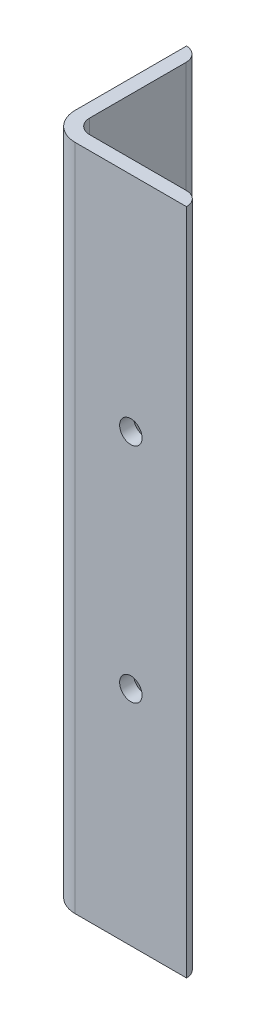
ISO-10303-21;
HEADER;
FILE_DESCRIPTION(('STEP AP214'),'2;1');
FILE_NAME('part.step','',(''),(''),'','','');
FILE_SCHEMA(('AUTOMOTIVE_DESIGN { 1 0 10303 214 1 1 1 1 }'));
ENDSEC;
DATA;
#1=APPLICATION_CONTEXT('core data for automotive mechanical design processes');
#2=APPLICATION_PROTOCOL_DEFINITION('international standard','automotive_design',2000,#1);
#3=PRODUCT_CONTEXT('',#1,'mechanical');
#4=PRODUCT('Part','Part','',(#3));
#5=PRODUCT_RELATED_PRODUCT_CATEGORY('part','',(#4));
#6=PRODUCT_DEFINITION_FORMATION('','',#4);
#7=PRODUCT_DEFINITION_CONTEXT('part definition',#1,'design');
#8=PRODUCT_DEFINITION('design','',#6,#7);
#9=PRODUCT_DEFINITION_SHAPE('','',#8);
#10=(LENGTH_UNIT() NAMED_UNIT(*) SI_UNIT(.MILLI.,.METRE.));
#11=(NAMED_UNIT(*) PLANE_ANGLE_UNIT() SI_UNIT($,.RADIAN.));
#12=(NAMED_UNIT(*) SI_UNIT($,.STERADIAN.) SOLID_ANGLE_UNIT());
#13=UNCERTAINTY_MEASURE_WITH_UNIT(LENGTH_MEASURE(1.E-05),#10,'distance_accuracy_value','');
#14=(GEOMETRIC_REPRESENTATION_CONTEXT(3) GLOBAL_UNCERTAINTY_ASSIGNED_CONTEXT((#13)) GLOBAL_UNIT_ASSIGNED_CONTEXT((#10,
#11,#12)) REPRESENTATION_CONTEXT('',''));
#15=CARTESIAN_POINT('',(0.,0.,0.));
#16=DIRECTION('',(0.,0.,1.));
#17=DIRECTION('',(1.,0.,0.));
#18=AXIS2_PLACEMENT_3D('',#15,#16,#17);
#19=CARTESIAN_POINT('',(-12.7,0.,-15.875));
#20=DIRECTION('',(1.,0.,0.));
#21=DIRECTION('',(0.,0.,-1.));
#22=AXIS2_PLACEMENT_3D('',#19,#20,#21);
#23=CYLINDRICAL_SURFACE('',#22,2.5654);
#24=CARTESIAN_POINT('',(-12.7,0.,-15.875));
#25=DIRECTION('',(1.,0.,0.));
#26=DIRECTION('',(0.,0.,-1.));
#27=AXIS2_PLACEMENT_3D('',#24,#25,#26);
#28=CIRCLE('',#27,2.5654);
#29=CARTESIAN_POINT('',(-12.7,0.,-18.4404));
#30=VERTEX_POINT('',#29);
#31=EDGE_CURVE('E19',#30,#30,#28,.F.);
#32=ORIENTED_EDGE('',*,*,#31,.F.);
#33=EDGE_LOOP('',(#32));
#34=FACE_BOUND('',#33,.T.);
#35=CARTESIAN_POINT('',(-15.875,0.,-15.875));
#36=DIRECTION('',(1.,0.,0.));
#37=DIRECTION('',(0.,0.,-1.));
#38=AXIS2_PLACEMENT_3D('',#35,#36,#37);
#39=CIRCLE('',#38,2.5654);
#40=CARTESIAN_POINT('',(-15.875,0.,-18.4404));
#41=VERTEX_POINT('',#40);
#42=EDGE_CURVE('E116',#41,#41,#39,.T.);
#43=ORIENTED_EDGE('',*,*,#42,.F.);
#44=EDGE_LOOP('',(#43));
#45=FACE_BOUND('',#44,.T.);
#46=ADVANCED_FACE('F16',(#34,#45),#23,.F.);
#47=CARTESIAN_POINT('',(-12.7,-38.1,-15.875));
#48=DIRECTION('',(1.,0.,0.));
#49=DIRECTION('',(0.,0.,-1.));
#50=AXIS2_PLACEMENT_3D('',#47,#48,#49);
#51=CYLINDRICAL_SURFACE('',#50,2.5654);
#52=CARTESIAN_POINT('',(-12.7,-38.1,-15.875));
#53=DIRECTION('',(1.,0.,0.));
#54=DIRECTION('',(0.,0.,-1.));
#55=AXIS2_PLACEMENT_3D('',#52,#53,#54);
#56=CIRCLE('',#55,2.5654);
#57=CARTESIAN_POINT('',(-12.7,-38.1,-18.4404));
#58=VERTEX_POINT('',#57);
#59=EDGE_CURVE('E123',#58,#58,#56,.F.);
#60=ORIENTED_EDGE('',*,*,#59,.F.);
#61=EDGE_LOOP('',(#60));
#62=FACE_BOUND('',#61,.T.);
#63=CARTESIAN_POINT('',(-15.875,-38.1,-15.875));
#64=DIRECTION('',(1.,0.,0.));
#65=DIRECTION('',(0.,0.,-1.));
#66=AXIS2_PLACEMENT_3D('',#63,#64,#65);
#67=CIRCLE('',#66,2.5654);
#68=CARTESIAN_POINT('',(-15.875,-38.1,-18.4404));
#69=VERTEX_POINT('',#68);
#70=EDGE_CURVE('E113',#69,#69,#67,.T.);
#71=ORIENTED_EDGE('',*,*,#70,.F.);
#72=EDGE_LOOP('',(#71));
#73=FACE_BOUND('',#72,.T.);
#74=ADVANCED_FACE('F310',(#62,#73),#51,.F.);
#75=CARTESIAN_POINT('',(-12.7,38.1,-15.875));
#76=DIRECTION('',(1.,0.,0.));
#77=DIRECTION('',(0.,0.,-1.));
#78=AXIS2_PLACEMENT_3D('',#75,#76,#77);
#79=CYLINDRICAL_SURFACE('',#78,2.5654);
#80=CARTESIAN_POINT('',(-12.7,38.1,-15.875));
#81=DIRECTION('',(1.,0.,0.));
#82=DIRECTION('',(0.,0.,-1.));
#83=AXIS2_PLACEMENT_3D('',#80,#81,#82);
#84=CIRCLE('',#83,2.5654);
#85=CARTESIAN_POINT('',(-12.7,38.1,-18.4404));
#86=VERTEX_POINT('',#85);
#87=EDGE_CURVE('E120',#86,#86,#84,.F.);
#88=ORIENTED_EDGE('',*,*,#87,.F.);
#89=EDGE_LOOP('',(#88));
#90=FACE_BOUND('',#89,.T.);
#91=CARTESIAN_POINT('',(-15.875,38.1,-15.875));
#92=DIRECTION('',(1.,0.,0.));
#93=DIRECTION('',(0.,0.,-1.));
#94=AXIS2_PLACEMENT_3D('',#91,#92,#93);
#95=CIRCLE('',#94,2.5654);
#96=CARTESIAN_POINT('',(-15.875,38.1,-18.4404));
#97=VERTEX_POINT('',#96);
#98=EDGE_CURVE('E92',#97,#97,#95,.T.);
#99=ORIENTED_EDGE('',*,*,#98,.F.);
#100=EDGE_LOOP('',(#99));
#101=FACE_BOUND('',#100,.T.);
#102=ADVANCED_FACE('F302',(#90,#101),#79,.F.);
#103=CARTESIAN_POINT('',(-9.398,274.86864,-3.302));
#104=DIRECTION('',(0.,-1.,0.));
#105=DIRECTION('',(0.,0.,-1.));
#106=AXIS2_PLACEMENT_3D('',#103,#104,#105);
#107=CYLINDRICAL_SURFACE('',#106,3.302);
#108=DIRECTION('',(0.,1.,0.));
#109=VECTOR('',#108,1.);
#110=CARTESIAN_POINT('',(-12.7,-76.2,-3.302));
#111=LINE('',#110,#109);
#112=CARTESIAN_POINT('',(-12.7,76.2,-3.302));
#113=VERTEX_POINT('',#112);
#114=CARTESIAN_POINT('',(-12.7,-76.2,-3.302));
#115=VERTEX_POINT('',#114);
#116=EDGE_CURVE('E75',#113,#115,#111,.F.);
#117=ORIENTED_EDGE('',*,*,#116,.F.);
#118=CARTESIAN_POINT('',(-9.398,76.2,-3.302));
#119=DIRECTION('',(0.,-1.,0.));
#120=DIRECTION('',(0.,0.,-1.));
#121=AXIS2_PLACEMENT_3D('',#118,#119,#120);
#122=CIRCLE('',#121,3.302);
#123=CARTESIAN_POINT('',(-9.398,76.2,0.));
#124=VERTEX_POINT('',#123);
#125=EDGE_CURVE('E87',#124,#113,#122,.T.);
#126=ORIENTED_EDGE('',*,*,#125,.F.);
#127=DIRECTION('',(0.,1.,0.));
#128=VECTOR('',#127,1.);
#129=CARTESIAN_POINT('',(-9.398,0.,0.));
#130=LINE('',#129,#128);
#131=CARTESIAN_POINT('',(-9.398,-76.2,0.));
#132=VERTEX_POINT('',#131);
#133=EDGE_CURVE('E80',#124,#132,#130,.F.);
#134=ORIENTED_EDGE('',*,*,#133,.T.);
#135=CARTESIAN_POINT('',(-9.398,-76.2,-3.302));
#136=DIRECTION('',(0.,-1.,0.));
#137=DIRECTION('',(0.,0.,-1.));
#138=AXIS2_PLACEMENT_3D('',#135,#136,#137);
#139=CIRCLE('',#138,3.302);
#140=EDGE_CURVE('E84',#115,#132,#139,.F.);
#141=ORIENTED_EDGE('',*,*,#140,.F.);
#142=EDGE_LOOP('',(#117,#126,#134,#141));
#143=FACE_BOUND('',#142,.T.);
#144=ADVANCED_FACE('F82',(#143),#107,.F.);
#145=CARTESIAN_POINT('',(-12.7,-76.2,3.175));
#146=DIRECTION('',(1.,0.,0.));
#147=DIRECTION('',(0.,0.,-1.));
#148=AXIS2_PLACEMENT_3D('',#145,#146,#147);
#149=PLANE('',#148);
#150=ORIENTED_EDGE('',*,*,#87,.T.);
#151=EDGE_LOOP('',(#150));
#152=FACE_BOUND('',#151,.T.);
#153=ORIENTED_EDGE('',*,*,#59,.T.);
#154=EDGE_LOOP('',(#153));
#155=FACE_BOUND('',#154,.T.);
#156=ORIENTED_EDGE('',*,*,#31,.T.);
#157=EDGE_LOOP('',(#156));
#158=FACE_BOUND('',#157,.T.);
#159=DIRECTION('',(0.,0.,-1.));
#160=VECTOR('',#159,1.);
#161=CARTESIAN_POINT('',(-12.7,-76.2,0.));
#162=LINE('',#161,#160);
#163=CARTESIAN_POINT('',(-12.7,-76.1999999999999,-25.2754432115813));
#164=VERTEX_POINT('',#163);
#165=EDGE_CURVE('E91',#164,#115,#162,.F.);
#166=ORIENTED_EDGE('',*,*,#165,.F.);
#167=DIRECTION('',(0.,-1.,0.));
#168=VECTOR('',#167,1.);
#169=CARTESIAN_POINT('',(-12.7,275.556361117561,-25.2754432115813));
#170=LINE('',#169,#168);
#171=CARTESIAN_POINT('',(-12.7,76.2,-25.2754432115813));
#172=VERTEX_POINT('',#171);
#173=EDGE_CURVE('E122',#172,#164,#170,.T.);
#174=ORIENTED_EDGE('',*,*,#173,.F.);
#175=DIRECTION('',(0.,0.,1.));
#176=VECTOR('',#175,1.);
#177=CARTESIAN_POINT('',(-12.7,76.2,0.));
#178=LINE('',#177,#176);
#179=EDGE_CURVE('E155',#113,#172,#178,.F.);
#180=ORIENTED_EDGE('',*,*,#179,.F.);
#181=ORIENTED_EDGE('',*,*,#116,.T.);
#182=EDGE_LOOP('',(#166,#174,#180,#181));
#183=FACE_BOUND('',#182,.T.);
#184=ADVANCED_FACE('F285',(#152,#155,#158,#183),#149,.T.);
#185=CARTESIAN_POINT('',(-16.002,275.556361117561,-25.2754432115813));
#186=DIRECTION('',(0.,-1.,0.));
#187=DIRECTION('',(0.,0.,-1.));
#188=AXIS2_PLACEMENT_3D('',#185,#186,#187);
#189=CYLINDRICAL_SURFACE('',#188,3.302);
#190=ORIENTED_EDGE('',*,*,#173,.T.);
#191=CARTESIAN_POINT('',(-16.002,-76.1999999999999,-25.2754432115813));
#192=DIRECTION('',(0.,-1.,0.));
#193=DIRECTION('',(0.,0.,-1.));
#194=AXIS2_PLACEMENT_3D('',#191,#192,#193);
#195=CIRCLE('',#194,3.302);
#196=CARTESIAN_POINT('',(-15.875,-76.1999999999999,-28.575));
#197=VERTEX_POINT('',#196);
#198=EDGE_CURVE('E109',#197,#164,#195,.T.);
#199=ORIENTED_EDGE('',*,*,#198,.F.);
#200=DIRECTION('',(0.,1.,0.));
#201=VECTOR('',#200,1.);
#202=CARTESIAN_POINT('',(-15.875,76.2,-28.575));
#203=LINE('',#202,#201);
#204=CARTESIAN_POINT('',(-15.875,76.2,-28.575));
#205=VERTEX_POINT('',#204);
#206=EDGE_CURVE('E119',#205,#197,#203,.F.);
#207=ORIENTED_EDGE('',*,*,#206,.F.);
#208=CARTESIAN_POINT('',(-16.002,76.2,-25.2754432115813));
#209=DIRECTION('',(0.,-1.,0.));
#210=DIRECTION('',(0.,0.,-1.));
#211=AXIS2_PLACEMENT_3D('',#208,#209,#210);
#212=CIRCLE('',#211,3.302);
#213=EDGE_CURVE('E152',#172,#205,#212,.F.);
#214=ORIENTED_EDGE('',*,*,#213,.F.);
#215=EDGE_LOOP('',(#190,#199,#207,#214));
#216=FACE_BOUND('',#215,.T.);
#217=ADVANCED_FACE('F276',(#216),#189,.T.);
#218=CARTESIAN_POINT('',(-15.875,76.2,0.));
#219=DIRECTION('',(-1.,0.,0.));
#220=DIRECTION('',(0.,0.,1.));
#221=AXIS2_PLACEMENT_3D('',#218,#219,#220);
#222=PLANE('',#221);
#223=ORIENTED_EDGE('',*,*,#98,.T.);
#224=EDGE_LOOP('',(#223));
#225=FACE_BOUND('',#224,.T.);
#226=ORIENTED_EDGE('',*,*,#70,.T.);
#227=EDGE_LOOP('',(#226));
#228=FACE_BOUND('',#227,.T.);
#229=ORIENTED_EDGE('',*,*,#42,.T.);
#230=EDGE_LOOP('',(#229));
#231=FACE_BOUND('',#230,.T.);
#232=DIRECTION('',(0.,0.,1.));
#233=VECTOR('',#232,1.);
#234=CARTESIAN_POINT('',(-15.875,76.2,0.));
#235=LINE('',#234,#233);
#236=CARTESIAN_POINT('',(-15.875,76.2,-3.175));
#237=VERTEX_POINT('',#236);
#238=EDGE_CURVE('E160',#205,#237,#235,.T.);
#239=ORIENTED_EDGE('',*,*,#238,.F.);
#240=ORIENTED_EDGE('',*,*,#206,.T.);
#241=DIRECTION('',(0.,0.,-1.));
#242=VECTOR('',#241,1.);
#243=CARTESIAN_POINT('',(-15.875,-76.2,0.));
#244=LINE('',#243,#242);
#245=CARTESIAN_POINT('',(-15.875,-76.2,-3.175));
#246=VERTEX_POINT('',#245);
#247=EDGE_CURVE('E100',#246,#197,#244,.T.);
#248=ORIENTED_EDGE('',*,*,#247,.F.);
#249=DIRECTION('',(0.,-1.,0.));
#250=VECTOR('',#249,1.);
#251=CARTESIAN_POINT('',(-15.875,274.86864,-3.175));
#252=LINE('',#251,#250);
#253=EDGE_CURVE('E150',#237,#246,#252,.T.);
#254=ORIENTED_EDGE('',*,*,#253,.F.);
#255=EDGE_LOOP('',(#239,#240,#248,#254));
#256=FACE_BOUND('',#255,.T.);
#257=ADVANCED_FACE('F185',(#225,#228,#231,#256),#222,.T.);
#258=CARTESIAN_POINT('',(0.,0.,0.));
#259=DIRECTION('',(0.,0.,1.));
#260=DIRECTION('',(1.,0.,0.));
#261=AXIS2_PLACEMENT_3D('',#258,#259,#260);
#262=PLANE('',#261);
#263=CARTESIAN_POINT('',(3.175,-25.4,0.));
#264=DIRECTION('',(0.,0.,-1.));
#265=DIRECTION('',(-1.,0.,0.));
#266=AXIS2_PLACEMENT_3D('',#263,#264,#265);
#267=CIRCLE('',#266,2.5654);
#268=CARTESIAN_POINT('',(0.6096,-25.4,0.));
#269=VERTEX_POINT('',#268);
#270=EDGE_CURVE('E140',#269,#269,#267,.F.);
#271=ORIENTED_EDGE('',*,*,#270,.T.);
#272=EDGE_LOOP('',(#271));
#273=FACE_BOUND('',#272,.T.);
#274=CARTESIAN_POINT('',(3.175,25.4,0.));
#275=DIRECTION('',(0.,0.,-1.));
#276=DIRECTION('',(-1.,0.,0.));
#277=AXIS2_PLACEMENT_3D('',#274,#275,#276);
#278=CIRCLE('',#277,2.5654);
#279=CARTESIAN_POINT('',(0.6096,25.4,0.));
#280=VERTEX_POINT('',#279);
#281=EDGE_CURVE('E144',#280,#280,#278,.F.);
#282=ORIENTED_EDGE('',*,*,#281,.T.);
#283=EDGE_LOOP('',(#282));
#284=FACE_BOUND('',#283,.T.);
#285=ORIENTED_EDGE('',*,*,#133,.F.);
#286=DIRECTION('',(1.,0.,0.));
#287=VECTOR('',#286,1.);
#288=CARTESIAN_POINT('',(15.875,76.2,0.));
#289=LINE('',#288,#287);
#290=CARTESIAN_POINT('',(12.7,76.2,0.));
#291=VERTEX_POINT('',#290);
#292=EDGE_CURVE('E157',#291,#124,#289,.F.);
#293=ORIENTED_EDGE('',*,*,#292,.F.);
#294=DIRECTION('',(0.,-1.,0.));
#295=VECTOR('',#294,1.);
#296=CARTESIAN_POINT('',(12.7,274.86864,0.));
#297=LINE('',#296,#295);
#298=CARTESIAN_POINT('',(12.7,-76.2,0.));
#299=VERTEX_POINT('',#298);
#300=EDGE_CURVE('E97',#299,#291,#297,.F.);
#301=ORIENTED_EDGE('',*,*,#300,.F.);
#302=DIRECTION('',(1.,0.,0.));
#303=VECTOR('',#302,1.);
#304=CARTESIAN_POINT('',(-15.875,-76.2,0.));
#305=LINE('',#304,#303);
#306=EDGE_CURVE('E95',#132,#299,#305,.T.);
#307=ORIENTED_EDGE('',*,*,#306,.F.);
#308=EDGE_LOOP('',(#285,#293,#301,#307));
#309=FACE_BOUND('',#308,.T.);
#310=ADVANCED_FACE('F96',(#273,#284,#309),#262,.F.);
#311=CARTESIAN_POINT('',(-15.875,-76.2,0.));
#312=DIRECTION('',(0.,-1.,0.));
#313=DIRECTION('',(0.,0.,-1.));
#314=AXIS2_PLACEMENT_3D('',#311,#312,#313);
#315=PLANE('',#314);
#316=ORIENTED_EDGE('',*,*,#247,.T.);
#317=ORIENTED_EDGE('',*,*,#198,.T.);
#318=ORIENTED_EDGE('',*,*,#165,.T.);
#319=ORIENTED_EDGE('',*,*,#140,.T.);
#320=ORIENTED_EDGE('',*,*,#306,.T.);
#321=CARTESIAN_POINT('',(12.7,-76.2,3.175));
#322=DIRECTION('',(0.,-1.,0.));
#323=DIRECTION('',(0.,0.,-1.));
#324=AXIS2_PLACEMENT_3D('',#321,#322,#323);
#325=CIRCLE('',#324,3.175);
#326=CARTESIAN_POINT('',(15.875,-76.2,3.175));
#327=VERTEX_POINT('',#326);
#328=EDGE_CURVE('E135',#327,#299,#325,.F.);
#329=ORIENTED_EDGE('',*,*,#328,.F.);
#330=DIRECTION('',(1.,0.,0.));
#331=VECTOR('',#330,1.);
#332=CARTESIAN_POINT('',(0.,-76.2,3.175));
#333=LINE('',#332,#331);
#334=CARTESIAN_POINT('',(-9.525,-76.2,3.175));
#335=VERTEX_POINT('',#334);
#336=EDGE_CURVE('E143',#335,#327,#333,.T.);
#337=ORIENTED_EDGE('',*,*,#336,.F.);
#338=CARTESIAN_POINT('',(-9.525,-76.2,-3.175));
#339=DIRECTION('',(0.,-1.,0.));
#340=DIRECTION('',(0.,0.,-1.));
#341=AXIS2_PLACEMENT_3D('',#338,#339,#340);
#342=CIRCLE('',#341,6.35);
#343=EDGE_CURVE('E147',#246,#335,#342,.F.);
#344=ORIENTED_EDGE('',*,*,#343,.F.);
#345=EDGE_LOOP('',(#316,#317,#318,#319,#320,#329,#337,#344));
#346=FACE_BOUND('',#345,.T.);
#347=ADVANCED_FACE('F103',(#346),#315,.T.);
#348=CARTESIAN_POINT('',(12.7,274.86864,3.175));
#349=DIRECTION('',(0.,-1.,0.));
#350=DIRECTION('',(0.,0.,-1.));
#351=AXIS2_PLACEMENT_3D('',#348,#349,#350);
#352=CYLINDRICAL_SURFACE('',#351,3.175);
#353=DIRECTION('',(0.,1.,0.));
#354=VECTOR('',#353,1.);
#355=CARTESIAN_POINT('',(15.875,0.,3.175));
#356=LINE('',#355,#354);
#357=CARTESIAN_POINT('',(15.875,76.2,3.175));
#358=VERTEX_POINT('',#357);
#359=EDGE_CURVE('E169',#327,#358,#356,.T.);
#360=ORIENTED_EDGE('',*,*,#359,.F.);
#361=ORIENTED_EDGE('',*,*,#328,.T.);
#362=ORIENTED_EDGE('',*,*,#300,.T.);
#363=CARTESIAN_POINT('',(12.7,76.2,3.175));
#364=DIRECTION('',(0.,-1.,0.));
#365=DIRECTION('',(0.,0.,-1.));
#366=AXIS2_PLACEMENT_3D('',#363,#364,#365);
#367=CIRCLE('',#366,3.175);
#368=EDGE_CURVE('E158',#358,#291,#367,.F.);
#369=ORIENTED_EDGE('',*,*,#368,.F.);
#370=EDGE_LOOP('',(#360,#361,#362,#369));
#371=FACE_BOUND('',#370,.T.);
#372=ADVANCED_FACE('F192',(#371),#352,.T.);
#373=CARTESIAN_POINT('',(15.875,76.2,0.));
#374=DIRECTION('',(0.,1.,0.));
#375=DIRECTION('',(0.,0.,1.));
#376=AXIS2_PLACEMENT_3D('',#373,#374,#375);
#377=PLANE('',#376);
#378=ORIENTED_EDGE('',*,*,#179,.T.);
#379=ORIENTED_EDGE('',*,*,#213,.T.);
#380=ORIENTED_EDGE('',*,*,#238,.T.);
#381=CARTESIAN_POINT('',(-9.525,76.2,-3.175));
#382=DIRECTION('',(0.,-1.,0.));
#383=DIRECTION('',(0.,0.,-1.));
#384=AXIS2_PLACEMENT_3D('',#381,#382,#383);
#385=CIRCLE('',#384,6.35);
#386=CARTESIAN_POINT('',(-9.525,76.2,3.175));
#387=VERTEX_POINT('',#386);
#388=EDGE_CURVE('E34',#387,#237,#385,.T.);
#389=ORIENTED_EDGE('',*,*,#388,.F.);
#390=DIRECTION('',(1.,0.,0.));
#391=VECTOR('',#390,1.);
#392=CARTESIAN_POINT('',(0.,76.2,3.175));
#393=LINE('',#392,#391);
#394=EDGE_CURVE('E172',#358,#387,#393,.F.);
#395=ORIENTED_EDGE('',*,*,#394,.F.);
#396=ORIENTED_EDGE('',*,*,#368,.T.);
#397=ORIENTED_EDGE('',*,*,#292,.T.);
#398=ORIENTED_EDGE('',*,*,#125,.T.);
#399=EDGE_LOOP('',(#378,#379,#380,#389,#395,#396,#397,#398));
#400=FACE_BOUND('',#399,.T.);
#401=ADVANCED_FACE('F191',(#400),#377,.T.);
#402=CARTESIAN_POINT('',(-9.525,274.86864,-3.175));
#403=DIRECTION('',(0.,-1.,0.));
#404=DIRECTION('',(0.,0.,-1.));
#405=AXIS2_PLACEMENT_3D('',#402,#403,#404);
#406=CYLINDRICAL_SURFACE('',#405,6.35);
#407=ORIENTED_EDGE('',*,*,#253,.T.);
#408=ORIENTED_EDGE('',*,*,#343,.T.);
#409=DIRECTION('',(0.,1.,0.));
#410=VECTOR('',#409,1.);
#411=CARTESIAN_POINT('',(-9.525,0.,3.175));
#412=LINE('',#411,#410);
#413=EDGE_CURVE('E139',#387,#335,#412,.F.);
#414=ORIENTED_EDGE('',*,*,#413,.F.);
#415=ORIENTED_EDGE('',*,*,#388,.T.);
#416=EDGE_LOOP('',(#407,#408,#414,#415));
#417=FACE_BOUND('',#416,.T.);
#418=ADVANCED_FACE('F181',(#417),#406,.T.);
#419=CARTESIAN_POINT('',(3.175,25.4,0.));
#420=DIRECTION('',(0.,0.,-1.));
#421=DIRECTION('',(-1.,0.,0.));
#422=AXIS2_PLACEMENT_3D('',#419,#420,#421);
#423=CYLINDRICAL_SURFACE('',#422,2.5654);
#424=CARTESIAN_POINT('',(3.175,25.4,3.175));
#425=DIRECTION('',(0.,0.,-1.));
#426=DIRECTION('',(-1.,0.,0.));
#427=AXIS2_PLACEMENT_3D('',#424,#425,#426);
#428=CIRCLE('',#427,2.5654);
#429=CARTESIAN_POINT('',(0.6096,25.4,3.175));
#430=VERTEX_POINT('',#429);
#431=EDGE_CURVE('E25',#430,#430,#428,.T.);
#432=ORIENTED_EDGE('',*,*,#431,.F.);
#433=EDGE_LOOP('',(#432));
#434=FACE_BOUND('',#433,.T.);
#435=ORIENTED_EDGE('',*,*,#281,.F.);
#436=EDGE_LOOP('',(#435));
#437=FACE_BOUND('',#436,.T.);
#438=ADVANCED_FACE('F209',(#434,#437),#423,.F.);
#439=CARTESIAN_POINT('',(3.175,-25.4,0.));
#440=DIRECTION('',(0.,0.,-1.));
#441=DIRECTION('',(-1.,0.,0.));
#442=AXIS2_PLACEMENT_3D('',#439,#440,#441);
#443=CYLINDRICAL_SURFACE('',#442,2.5654);
#444=CARTESIAN_POINT('',(3.175,-25.4,3.175));
#445=DIRECTION('',(0.,0.,-1.));
#446=DIRECTION('',(-1.,0.,0.));
#447=AXIS2_PLACEMENT_3D('',#444,#445,#446);
#448=CIRCLE('',#447,2.5654);
#449=CARTESIAN_POINT('',(0.6096,-25.4,3.175));
#450=VERTEX_POINT('',#449);
#451=EDGE_CURVE('E11',#450,#450,#448,.T.);
#452=ORIENTED_EDGE('',*,*,#451,.F.);
#453=EDGE_LOOP('',(#452));
#454=FACE_BOUND('',#453,.T.);
#455=ORIENTED_EDGE('',*,*,#270,.F.);
#456=EDGE_LOOP('',(#455));
#457=FACE_BOUND('',#456,.T.);
#458=ADVANCED_FACE('F203',(#454,#457),#443,.F.);
#459=CARTESIAN_POINT('',(0.,0.,3.175));
#460=DIRECTION('',(0.,0.,1.));
#461=DIRECTION('',(1.,0.,0.));
#462=AXIS2_PLACEMENT_3D('',#459,#460,#461);
#463=PLANE('',#462);
#464=ORIENTED_EDGE('',*,*,#451,.T.);
#465=EDGE_LOOP('',(#464));
#466=FACE_BOUND('',#465,.T.);
#467=ORIENTED_EDGE('',*,*,#431,.T.);
#468=EDGE_LOOP('',(#467));
#469=FACE_BOUND('',#468,.T.);
#470=ORIENTED_EDGE('',*,*,#394,.T.);
#471=ORIENTED_EDGE('',*,*,#413,.T.);
#472=ORIENTED_EDGE('',*,*,#336,.T.);
#473=ORIENTED_EDGE('',*,*,#359,.T.);
#474=EDGE_LOOP('',(#470,#471,#472,#473));
#475=FACE_BOUND('',#474,.T.);
#476=ADVANCED_FACE('F189',(#466,#469,#475),#463,.T.);
#477=CLOSED_SHELL('',(#46,#74,#102,#144,#184,#217,#257,#310,#347,#372,#401,#418,#438,#458,#476));
#478=MANIFOLD_SOLID_BREP('B1',#477);
#479=ADVANCED_BREP_SHAPE_REPRESENTATION('',(#18,#478),#14);
#480=SHAPE_DEFINITION_REPRESENTATION(#9,#479);
ENDSEC;
END-ISO-10303-21;
